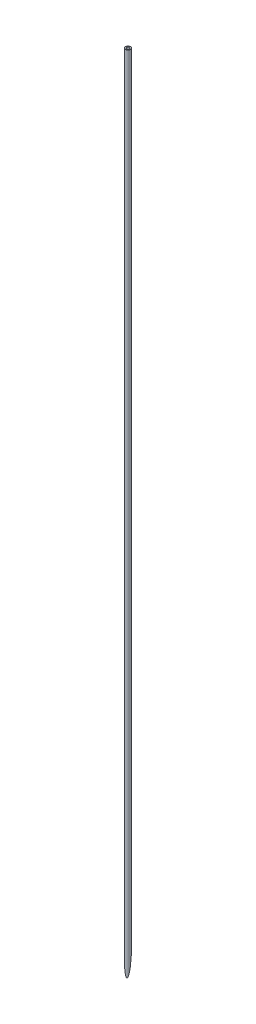
ISO-10303-21;
HEADER;
FILE_DESCRIPTION(('STEP AP214'),'2;1');
FILE_NAME('part.step','',(''),(''),'','','');
FILE_SCHEMA(('AUTOMOTIVE_DESIGN { 1 0 10303 214 1 1 1 1 }'));
ENDSEC;
DATA;
#1=APPLICATION_CONTEXT('core data for automotive mechanical design processes');
#2=APPLICATION_PROTOCOL_DEFINITION('international standard','automotive_design',2000,#1);
#3=PRODUCT_CONTEXT('',#1,'mechanical');
#4=PRODUCT('Part','Part','',(#3));
#5=PRODUCT_RELATED_PRODUCT_CATEGORY('part','',(#4));
#6=PRODUCT_DEFINITION_FORMATION('','',#4);
#7=PRODUCT_DEFINITION_CONTEXT('part definition',#1,'design');
#8=PRODUCT_DEFINITION('design','',#6,#7);
#9=PRODUCT_DEFINITION_SHAPE('','',#8);
#10=(LENGTH_UNIT() NAMED_UNIT(*) SI_UNIT(.MILLI.,.METRE.));
#11=(NAMED_UNIT(*) PLANE_ANGLE_UNIT() SI_UNIT($,.RADIAN.));
#12=(NAMED_UNIT(*) SI_UNIT($,.STERADIAN.) SOLID_ANGLE_UNIT());
#13=UNCERTAINTY_MEASURE_WITH_UNIT(LENGTH_MEASURE(1.E-05),#10,'distance_accuracy_value','');
#14=(GEOMETRIC_REPRESENTATION_CONTEXT(3) GLOBAL_UNCERTAINTY_ASSIGNED_CONTEXT((#13)) GLOBAL_UNIT_ASSIGNED_CONTEXT((#10,
#11,#12)) REPRESENTATION_CONTEXT('',''));
#15=CARTESIAN_POINT('',(0.,0.,0.));
#16=DIRECTION('',(0.,0.,1.));
#17=DIRECTION('',(1.,0.,0.));
#18=AXIS2_PLACEMENT_3D('',#15,#16,#17);
#19=CARTESIAN_POINT('',(0.451523516411385,-24.5139095006696,1.92079892502106));
#20=DIRECTION('',(0.,1.,0.));
#21=DIRECTION('',(0.,0.,1.));
#22=AXIS2_PLACEMENT_3D('',#19,#20,#21);
#23=CYLINDRICAL_SURFACE('',#22,0.0999999999999999);
#24=CARTESIAN_POINT('',(0.451523516411385,7.23609049933043,1.92079892502106));
#25=DIRECTION('',(0.,-1.,0.));
#26=DIRECTION('',(0.,0.,-1.));
#27=AXIS2_PLACEMENT_3D('',#24,#25,#26);
#28=CIRCLE('',#27,0.1);
#29=CARTESIAN_POINT('',(0.451523516411385,7.23609049933043,1.82079892502106));
#30=VERTEX_POINT('',#29);
#31=EDGE_CURVE('E10',#30,#30,#28,.T.);
#32=ORIENTED_EDGE('',*,*,#31,.T.);
#33=EDGE_LOOP('',(#32));
#34=FACE_BOUND('',#33,.T.);
#35=CARTESIAN_POINT('',(0.405325786451087,-23.0139095006696,1.83210975010938));
#36=CARTESIAN_POINT('',(0.582704136274456,-23.0139095006696,1.73971429018878));
#37=CARTESIAN_POINT('',(0.675099596195052,-24.5139095006696,1.91709264001215));
#38=CARTESIAN_POINT('',(0.497721246371682,-24.5139095006696,2.00948809993274));
#39=CARTESIAN_POINT('',(0.320342896548313,-24.5139095006696,2.10188355985334));
#40=CARTESIAN_POINT('',(0.227947436627718,-23.0139095006696,1.92450521002997));
#41=CARTESIAN_POINT('',(0.405325786451087,-23.0139095006696,1.83210975010938));
#42=(BOUNDED_CURVE() B_SPLINE_CURVE(3,(#35,#36,#37,#38,#39,#40,#41),.UNSPECIFIED.,.T.,
.F.) B_SPLINE_CURVE_WITH_KNOTS((4,3,4),(0.,0.5,1.),
.UNSPECIFIED.) CURVE() GEOMETRIC_REPRESENTATION_ITEM() RATIONAL_B_SPLINE_CURVE((1.,
0.333333333333333,0.333333333333333,1.,0.333333333333333,0.333333333333333,1.)) REPRESENTATION_ITEM(''));
#43=CARTESIAN_POINT('',(0.405325786451087,-23.0139095006696,1.83210975010938));
#44=VERTEX_POINT('',#43);
#45=EDGE_CURVE('E56',#44,#44,#42,.T.);
#46=ORIENTED_EDGE('',*,*,#45,.F.);
#47=EDGE_LOOP('',(#46));
#48=FACE_BOUND('',#47,.T.);
#49=ADVANCED_FACE('F41',(#34,#48),#23,.T.);
#50=CARTESIAN_POINT('',(0.451523516411385,-24.5139095006696,1.92079892502106));
#51=DIRECTION('',(0.,1.,0.));
#52=DIRECTION('',(0.,0.,1.));
#53=AXIS2_PLACEMENT_3D('',#50,#51,#52);
#54=CYLINDRICAL_SURFACE('',#53,0.0625000000000001);
#55=CARTESIAN_POINT('',(0.451523516411385,7.23609049933043,1.92079892502106));
#56=DIRECTION('',(0.,-1.,0.));
#57=DIRECTION('',(0.,0.,-1.));
#58=AXIS2_PLACEMENT_3D('',#55,#56,#57);
#59=CIRCLE('',#58,0.0625);
#60=CARTESIAN_POINT('',(0.451523516411385,7.23609049933043,1.85829892502106));
#61=VERTEX_POINT('',#60);
#62=EDGE_CURVE('E51',#61,#61,#59,.T.);
#63=ORIENTED_EDGE('',*,*,#62,.F.);
#64=EDGE_LOOP('',(#63));
#65=FACE_BOUND('',#64,.T.);
#66=CARTESIAN_POINT('',(0.422649935186199,-23.2951595006696,1.86536819070126));
#67=CARTESIAN_POINT('',(0.533511403825805,-23.2951595006696,1.80762102825089));
#68=CARTESIAN_POINT('',(0.591258566276177,-24.2326595006696,1.91848249689049));
#69=CARTESIAN_POINT('',(0.480397097636571,-24.2326595006696,1.97622965934086));
#70=CARTESIAN_POINT('',(0.369535628996965,-24.2326595006696,2.03397682179124));
#71=CARTESIAN_POINT('',(0.311788466546593,-23.2951595006696,1.92311535315163));
#72=CARTESIAN_POINT('',(0.422649935186199,-23.2951595006696,1.86536819070126));
#73=(BOUNDED_CURVE() B_SPLINE_CURVE(3,(#66,#67,#68,#69,#70,#71,#72),.UNSPECIFIED.,.T.,
.F.) B_SPLINE_CURVE_WITH_KNOTS((4,3,4),(0.,0.5,1.),
.UNSPECIFIED.) CURVE() GEOMETRIC_REPRESENTATION_ITEM() RATIONAL_B_SPLINE_CURVE((1.,
0.333333333333333,0.333333333333333,1.,0.333333333333333,0.333333333333333,1.)) REPRESENTATION_ITEM(''));
#74=CARTESIAN_POINT('',(0.422649935186199,-23.2951595006696,1.86536819070126));
#75=VERTEX_POINT('',#74);
#76=EDGE_CURVE('E45',#75,#75,#73,.T.);
#77=ORIENTED_EDGE('',*,*,#76,.T.);
#78=EDGE_LOOP('',(#77));
#79=FACE_BOUND('',#78,.T.);
#80=ADVANCED_FACE('F69',(#65,#79),#54,.F.);
#81=CARTESIAN_POINT('',(0.451523516411385,7.23609049933043,1.92079892502106));
#82=DIRECTION('',(0.,-1.,0.));
#83=DIRECTION('',(-0.886891749116848,0.,0.461977299602977));
#84=AXIS2_PLACEMENT_3D('',#81,#82,#83);
#85=PLANE('',#84);
#86=ORIENTED_EDGE('',*,*,#31,.F.);
#87=EDGE_LOOP('',(#86));
#88=FACE_BOUND('',#87,.T.);
#89=ORIENTED_EDGE('',*,*,#62,.T.);
#90=EDGE_LOOP('',(#89));
#91=FACE_BOUND('',#90,.T.);
#92=ADVANCED_FACE('F72',(#88,#91),#85,.F.);
#93=CARTESIAN_POINT('',(0.0542753718132585,-24.5139095006696,2.24047674973423));
#94=DIRECTION('',(-0.457924788848491,-0.132163720091018,-0.879111846609843));
#95=DIRECTION('',(0.0610566385131321,-0.991227900682635,0.117214912881312));
#96=AXIS2_PLACEMENT_3D('',#93,#94,#95);
#97=PLANE('',#96);
#98=ORIENTED_EDGE('',*,*,#76,.F.);
#99=EDGE_LOOP('',(#98));
#100=FACE_BOUND('',#99,.T.);
#101=ORIENTED_EDGE('',*,*,#45,.T.);
#102=EDGE_LOOP('',(#101));
#103=FACE_BOUND('',#102,.T.);
#104=ADVANCED_FACE('F43',(#100,#103),#97,.T.);
#105=CLOSED_SHELL('',(#49,#80,#92,#104));
#106=MANIFOLD_SOLID_BREP('B2',#105);
#107=ADVANCED_BREP_SHAPE_REPRESENTATION('',(#18,#106),#14);
#108=SHAPE_DEFINITION_REPRESENTATION(#9,#107);
ENDSEC;
END-ISO-10303-21;
